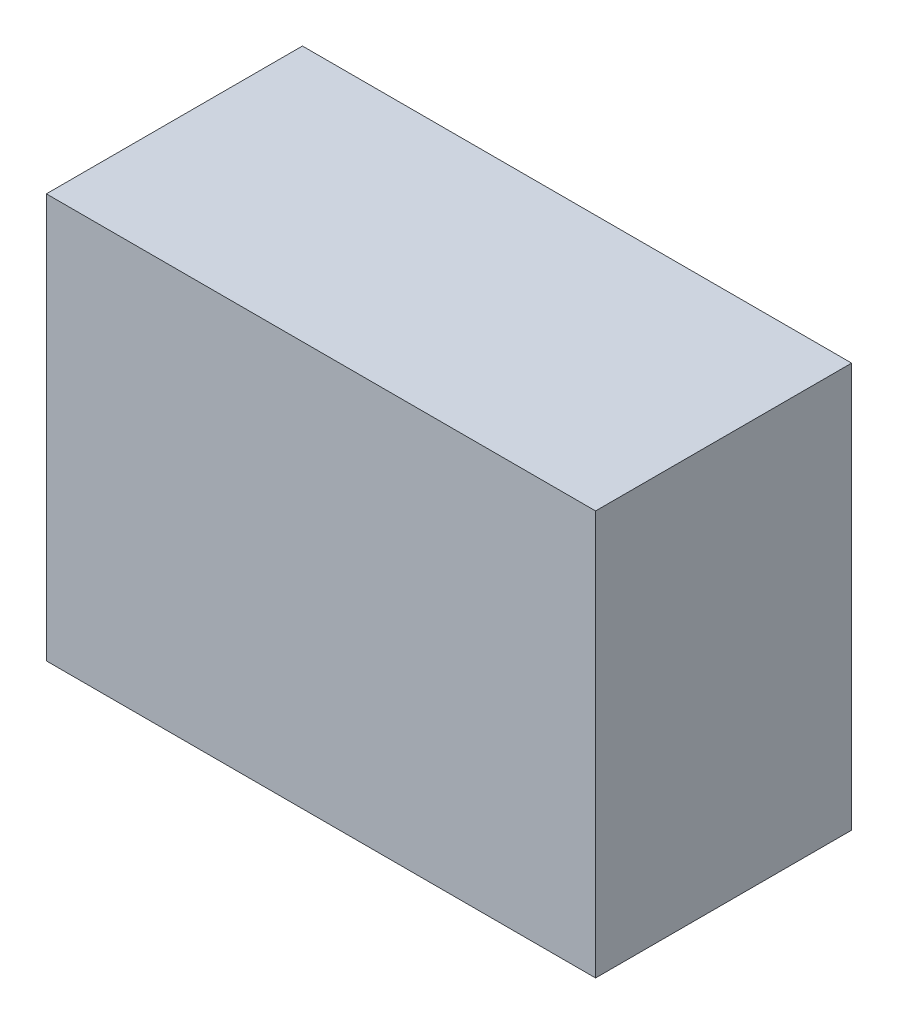
ISO-10303-21;
HEADER;
FILE_DESCRIPTION(('STEP AP214'),'2;1');
FILE_NAME('part.step','',(''),(''),'','','');
FILE_SCHEMA(('AUTOMOTIVE_DESIGN { 1 0 10303 214 1 1 1 1 }'));
ENDSEC;
DATA;
#1=APPLICATION_CONTEXT('core data for automotive mechanical design processes');
#2=APPLICATION_PROTOCOL_DEFINITION('international standard','automotive_design',2000,#1);
#3=PRODUCT_CONTEXT('',#1,'mechanical');
#4=PRODUCT('Part','Part','',(#3));
#5=PRODUCT_RELATED_PRODUCT_CATEGORY('part','',(#4));
#6=PRODUCT_DEFINITION_FORMATION('','',#4);
#7=PRODUCT_DEFINITION_CONTEXT('part definition',#1,'design');
#8=PRODUCT_DEFINITION('design','',#6,#7);
#9=PRODUCT_DEFINITION_SHAPE('','',#8);
#10=(LENGTH_UNIT() NAMED_UNIT(*) SI_UNIT(.MILLI.,.METRE.));
#11=(NAMED_UNIT(*) PLANE_ANGLE_UNIT() SI_UNIT($,.RADIAN.));
#12=(NAMED_UNIT(*) SI_UNIT($,.STERADIAN.) SOLID_ANGLE_UNIT());
#13=UNCERTAINTY_MEASURE_WITH_UNIT(LENGTH_MEASURE(1.E-05),#10,'distance_accuracy_value','');
#14=(GEOMETRIC_REPRESENTATION_CONTEXT(3) GLOBAL_UNCERTAINTY_ASSIGNED_CONTEXT((#13)) GLOBAL_UNIT_ASSIGNED_CONTEXT((#10,
#11,#12)) REPRESENTATION_CONTEXT('',''));
#15=CARTESIAN_POINT('',(0.,0.,0.));
#16=DIRECTION('',(0.,0.,1.));
#17=DIRECTION('',(1.,0.,0.));
#18=AXIS2_PLACEMENT_3D('',#15,#16,#17);
#19=CARTESIAN_POINT('',(0.,10.9,0.));
#20=DIRECTION('',(1.,0.,0.));
#21=DIRECTION('',(0.,0.,-1.));
#22=AXIS2_PLACEMENT_3D('',#19,#20,#21);
#23=PLANE('',#22);
#24=DIRECTION('',(0.,0.,1.));
#25=VECTOR('',#24,1.);
#26=CARTESIAN_POINT('',(0.,0.,0.));
#27=LINE('',#26,#25);
#28=CARTESIAN_POINT('',(0.,0.,-6.9));
#29=VERTEX_POINT('',#28);
#30=CARTESIAN_POINT('',(0.,0.,0.));
#31=VERTEX_POINT('',#30);
#32=EDGE_CURVE('E96',#29,#31,#27,.T.);
#33=ORIENTED_EDGE('',*,*,#32,.T.);
#34=DIRECTION('',(0.,-1.,0.));
#35=VECTOR('',#34,1.);
#36=CARTESIAN_POINT('',(0.,10.9,0.));
#37=LINE('',#36,#35);
#38=CARTESIAN_POINT('',(0.,10.9,0.));
#39=VERTEX_POINT('',#38);
#40=EDGE_CURVE('E11',#39,#31,#37,.T.);
#41=ORIENTED_EDGE('',*,*,#40,.F.);
#42=DIRECTION('',(0.,0.,1.));
#43=VECTOR('',#42,1.);
#44=CARTESIAN_POINT('',(0.,10.9,0.));
#45=LINE('',#44,#43);
#46=CARTESIAN_POINT('',(0.,10.9,-6.9));
#47=VERTEX_POINT('',#46);
#48=EDGE_CURVE('E84',#47,#39,#45,.T.);
#49=ORIENTED_EDGE('',*,*,#48,.F.);
#50=DIRECTION('',(0.,-1.,0.));
#51=VECTOR('',#50,1.);
#52=CARTESIAN_POINT('',(0.,10.9,-6.9));
#53=LINE('',#52,#51);
#54=EDGE_CURVE('E92',#47,#29,#53,.T.);
#55=ORIENTED_EDGE('',*,*,#54,.T.);
#56=EDGE_LOOP('',(#33,#41,#49,#55));
#57=FACE_BOUND('',#56,.T.);
#58=ADVANCED_FACE('F33',(#57),#23,.F.);
#59=CARTESIAN_POINT('',(0.,10.9,0.));
#60=DIRECTION('',(0.,0.,-1.));
#61=DIRECTION('',(-1.,0.,0.));
#62=AXIS2_PLACEMENT_3D('',#59,#60,#61);
#63=PLANE('',#62);
#64=DIRECTION('',(1.,0.,0.));
#65=VECTOR('',#64,1.);
#66=CARTESIAN_POINT('',(0.,0.,0.));
#67=LINE('',#66,#65);
#68=CARTESIAN_POINT('',(14.8,0.,0.));
#69=VERTEX_POINT('',#68);
#70=EDGE_CURVE('E88',#31,#69,#67,.T.);
#71=ORIENTED_EDGE('',*,*,#70,.T.);
#72=DIRECTION('',(0.,-1.,0.));
#73=VECTOR('',#72,1.);
#74=CARTESIAN_POINT('',(14.8,10.9,0.));
#75=LINE('',#74,#73);
#76=CARTESIAN_POINT('',(14.8,10.9,0.));
#77=VERTEX_POINT('',#76);
#78=EDGE_CURVE('E41',#77,#69,#75,.T.);
#79=ORIENTED_EDGE('',*,*,#78,.F.);
#80=DIRECTION('',(1.,0.,0.));
#81=VECTOR('',#80,1.);
#82=CARTESIAN_POINT('',(0.,10.9,0.));
#83=LINE('',#82,#81);
#84=EDGE_CURVE('E79',#39,#77,#83,.T.);
#85=ORIENTED_EDGE('',*,*,#84,.F.);
#86=ORIENTED_EDGE('',*,*,#40,.T.);
#87=EDGE_LOOP('',(#71,#79,#85,#86));
#88=FACE_BOUND('',#87,.T.);
#89=ADVANCED_FACE('F87',(#88),#63,.F.);
#90=CARTESIAN_POINT('',(14.8,10.9,0.));
#91=DIRECTION('',(-1.,0.,0.));
#92=DIRECTION('',(0.,0.,1.));
#93=AXIS2_PLACEMENT_3D('',#90,#91,#92);
#94=PLANE('',#93);
#95=DIRECTION('',(0.,0.,-1.));
#96=VECTOR('',#95,1.);
#97=CARTESIAN_POINT('',(14.8,0.,0.));
#98=LINE('',#97,#96);
#99=CARTESIAN_POINT('',(14.8,0.,-6.9));
#100=VERTEX_POINT('',#99);
#101=EDGE_CURVE('E66',#69,#100,#98,.T.);
#102=ORIENTED_EDGE('',*,*,#101,.T.);
#103=DIRECTION('',(0.,-1.,0.));
#104=VECTOR('',#103,1.);
#105=CARTESIAN_POINT('',(14.8,10.9,-6.9));
#106=LINE('',#105,#104);
#107=CARTESIAN_POINT('',(14.8,10.9,-6.9));
#108=VERTEX_POINT('',#107);
#109=EDGE_CURVE('E89',#108,#100,#106,.T.);
#110=ORIENTED_EDGE('',*,*,#109,.F.);
#111=DIRECTION('',(0.,0.,-1.));
#112=VECTOR('',#111,1.);
#113=CARTESIAN_POINT('',(14.8,10.9,0.));
#114=LINE('',#113,#112);
#115=EDGE_CURVE('E82',#77,#108,#114,.T.);
#116=ORIENTED_EDGE('',*,*,#115,.F.);
#117=ORIENTED_EDGE('',*,*,#78,.T.);
#118=EDGE_LOOP('',(#102,#110,#116,#117));
#119=FACE_BOUND('',#118,.T.);
#120=ADVANCED_FACE('F90',(#119),#94,.F.);
#121=CARTESIAN_POINT('',(0.,10.9,-6.9));
#122=DIRECTION('',(0.,0.,1.));
#123=DIRECTION('',(1.,0.,0.));
#124=AXIS2_PLACEMENT_3D('',#121,#122,#123);
#125=PLANE('',#124);
#126=DIRECTION('',(-1.,0.,0.));
#127=VECTOR('',#126,1.);
#128=CARTESIAN_POINT('',(0.,0.,-6.9));
#129=LINE('',#128,#127);
#130=EDGE_CURVE('E72',#100,#29,#129,.T.);
#131=ORIENTED_EDGE('',*,*,#130,.T.);
#132=ORIENTED_EDGE('',*,*,#54,.F.);
#133=DIRECTION('',(-1.,0.,0.));
#134=VECTOR('',#133,1.);
#135=CARTESIAN_POINT('',(0.,10.9,-6.9));
#136=LINE('',#135,#134);
#137=EDGE_CURVE('E49',#108,#47,#136,.T.);
#138=ORIENTED_EDGE('',*,*,#137,.F.);
#139=ORIENTED_EDGE('',*,*,#109,.T.);
#140=EDGE_LOOP('',(#131,#132,#138,#139));
#141=FACE_BOUND('',#140,.T.);
#142=ADVANCED_FACE('F103',(#141),#125,.F.);
#143=CARTESIAN_POINT('',(0.,10.9,0.));
#144=DIRECTION('',(0.,-1.,0.));
#145=DIRECTION('',(0.,0.,-1.));
#146=AXIS2_PLACEMENT_3D('',#143,#144,#145);
#147=PLANE('',#146);
#148=ORIENTED_EDGE('',*,*,#48,.T.);
#149=ORIENTED_EDGE('',*,*,#84,.T.);
#150=ORIENTED_EDGE('',*,*,#115,.T.);
#151=ORIENTED_EDGE('',*,*,#137,.T.);
#152=EDGE_LOOP('',(#148,#149,#150,#151));
#153=FACE_BOUND('',#152,.T.);
#154=ADVANCED_FACE('F80',(#153),#147,.F.);
#155=CARTESIAN_POINT('',(0.,0.,0.));
#156=DIRECTION('',(0.,-1.,0.));
#157=DIRECTION('',(0.,0.,-1.));
#158=AXIS2_PLACEMENT_3D('',#155,#156,#157);
#159=PLANE('',#158);
#160=ORIENTED_EDGE('',*,*,#32,.F.);
#161=ORIENTED_EDGE('',*,*,#130,.F.);
#162=ORIENTED_EDGE('',*,*,#101,.F.);
#163=ORIENTED_EDGE('',*,*,#70,.F.);
#164=EDGE_LOOP('',(#160,#161,#162,#163));
#165=FACE_BOUND('',#164,.T.);
#166=ADVANCED_FACE('F106',(#165),#159,.T.);
#167=CLOSED_SHELL('',(#58,#89,#120,#142,#154,#166));
#168=MANIFOLD_SOLID_BREP('B2',#167);
#169=ADVANCED_BREP_SHAPE_REPRESENTATION('',(#18,#168),#14);
#170=SHAPE_DEFINITION_REPRESENTATION(#9,#169);
ENDSEC;
END-ISO-10303-21;
